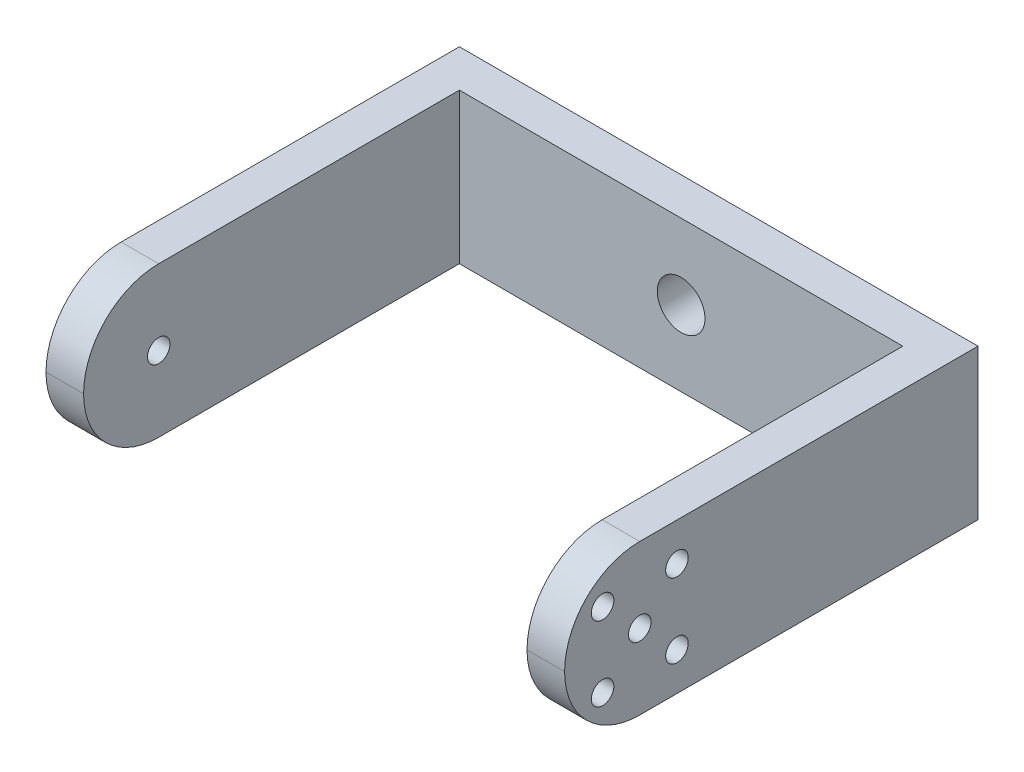
ISO-10303-21;
HEADER;
FILE_DESCRIPTION(('STEP AP214'),'2;1');
FILE_NAME('part.step','',(''),(''),'','','');
FILE_SCHEMA(('AUTOMOTIVE_DESIGN { 1 0 10303 214 1 1 1 1 }'));
ENDSEC;
DATA;
#1=APPLICATION_CONTEXT('core data for automotive mechanical design processes');
#2=APPLICATION_PROTOCOL_DEFINITION('international standard','automotive_design',2000,#1);
#3=PRODUCT_CONTEXT('',#1,'mechanical');
#4=PRODUCT('Part','Part','',(#3));
#5=PRODUCT_RELATED_PRODUCT_CATEGORY('part','',(#4));
#6=PRODUCT_DEFINITION_FORMATION('','',#4);
#7=PRODUCT_DEFINITION_CONTEXT('part definition',#1,'design');
#8=PRODUCT_DEFINITION('design','',#6,#7);
#9=PRODUCT_DEFINITION_SHAPE('','',#8);
#10=(LENGTH_UNIT() NAMED_UNIT(*) SI_UNIT(.MILLI.,.METRE.));
#11=(NAMED_UNIT(*) PLANE_ANGLE_UNIT() SI_UNIT($,.RADIAN.));
#12=(NAMED_UNIT(*) SI_UNIT($,.STERADIAN.) SOLID_ANGLE_UNIT());
#13=UNCERTAINTY_MEASURE_WITH_UNIT(LENGTH_MEASURE(1.E-05),#10,'distance_accuracy_value','');
#14=(GEOMETRIC_REPRESENTATION_CONTEXT(3) GLOBAL_UNCERTAINTY_ASSIGNED_CONTEXT((#13)) GLOBAL_UNIT_ASSIGNED_CONTEXT((#10,
#11,#12)) REPRESENTATION_CONTEXT('',''));
#15=CARTESIAN_POINT('',(0.,0.,0.));
#16=DIRECTION('',(0.,0.,1.));
#17=DIRECTION('',(1.,0.,0.));
#18=AXIS2_PLACEMENT_3D('',#15,#16,#17);
#19=CARTESIAN_POINT('',(0.,0.,5.));
#20=DIRECTION('',(0.,0.,1.));
#21=DIRECTION('',(1.,0.,0.));
#22=AXIS2_PLACEMENT_3D('',#19,#20,#21);
#23=PLANE('',#22);
#24=CARTESIAN_POINT('',(0.,0.,5.));
#25=DIRECTION('',(0.,0.,1.));
#26=DIRECTION('',(1.,0.,0.));
#27=AXIS2_PLACEMENT_3D('',#24,#25,#26);
#28=CIRCLE('',#27,3.175);
#29=CARTESIAN_POINT('',(3.175,0.,5.));
#30=VERTEX_POINT('',#29);
#31=EDGE_CURVE('E399',#30,#30,#28,.T.);
#32=ORIENTED_EDGE('',*,*,#31,.F.);
#33=EDGE_LOOP('',(#32));
#34=FACE_BOUND('',#33,.T.);
#35=DIRECTION('',(1.,0.,0.));
#36=VECTOR('',#35,1.);
#37=CARTESIAN_POINT('',(-34.5,-10.,5.));
#38=LINE('',#37,#36);
#39=CARTESIAN_POINT('',(-29.5,-10.,5.));
#40=VERTEX_POINT('',#39);
#41=CARTESIAN_POINT('',(29.5,-10.,5.));
#42=VERTEX_POINT('',#41);
#43=EDGE_CURVE('E132',#40,#42,#38,.T.);
#44=ORIENTED_EDGE('',*,*,#43,.T.);
#45=DIRECTION('',(0.,-1.,0.));
#46=VECTOR('',#45,1.);
#47=CARTESIAN_POINT('',(29.5,10.,5.));
#48=LINE('',#47,#46);
#49=CARTESIAN_POINT('',(29.5,10.,5.));
#50=VERTEX_POINT('',#49);
#51=EDGE_CURVE('E131',#50,#42,#48,.T.);
#52=ORIENTED_EDGE('',*,*,#51,.F.);
#53=DIRECTION('',(-1.,0.,0.));
#54=VECTOR('',#53,1.);
#55=CARTESIAN_POINT('',(-34.5,10.,5.));
#56=LINE('',#55,#54);
#57=CARTESIAN_POINT('',(-29.5,10.,5.));
#58=VERTEX_POINT('',#57);
#59=EDGE_CURVE('E116',#50,#58,#56,.T.);
#60=ORIENTED_EDGE('',*,*,#59,.T.);
#61=DIRECTION('',(0.,1.,0.));
#62=VECTOR('',#61,1.);
#63=CARTESIAN_POINT('',(-29.5,10.,5.));
#64=LINE('',#63,#62);
#65=EDGE_CURVE('E123',#40,#58,#64,.T.);
#66=ORIENTED_EDGE('',*,*,#65,.F.);
#67=EDGE_LOOP('',(#44,#52,#60,#66));
#68=FACE_BOUND('',#67,.T.);
#69=ADVANCED_FACE('F33',(#34,#68),#23,.T.);
#70=CARTESIAN_POINT('',(34.5,10.,5.));
#71=DIRECTION('',(-1.,0.,0.));
#72=DIRECTION('',(0.,0.,1.));
#73=AXIS2_PLACEMENT_3D('',#70,#71,#72);
#74=PLANE('',#73);
#75=CARTESIAN_POINT('',(34.5,-4.94974746830594,49.9497474683059));
#76=DIRECTION('',(1.,0.,0.));
#77=DIRECTION('',(0.,0.,-1.));
#78=AXIS2_PLACEMENT_3D('',#75,#76,#77);
#79=CIRCLE('',#78,1.5);
#80=CARTESIAN_POINT('',(34.5,-4.94974746830594,48.4497474683059));
#81=VERTEX_POINT('',#80);
#82=EDGE_CURVE('E404',#81,#81,#79,.T.);
#83=ORIENTED_EDGE('',*,*,#82,.F.);
#84=EDGE_LOOP('',(#83));
#85=FACE_BOUND('',#84,.T.);
#86=CARTESIAN_POINT('',(34.5,-4.94974746830573,40.0502525316942));
#87=DIRECTION('',(1.,0.,0.));
#88=DIRECTION('',(0.,0.,-1.));
#89=AXIS2_PLACEMENT_3D('',#86,#87,#88);
#90=CIRCLE('',#89,1.5);
#91=CARTESIAN_POINT('',(34.5,-4.94974746830573,38.5502525316942));
#92=VERTEX_POINT('',#91);
#93=EDGE_CURVE('E410',#92,#92,#90,.T.);
#94=ORIENTED_EDGE('',*,*,#93,.F.);
#95=EDGE_LOOP('',(#94));
#96=FACE_BOUND('',#95,.T.);
#97=CARTESIAN_POINT('',(34.5,4.94974746830581,40.0502525316942));
#98=DIRECTION('',(1.,0.,0.));
#99=DIRECTION('',(0.,0.,-1.));
#100=AXIS2_PLACEMENT_3D('',#97,#98,#99);
#101=CIRCLE('',#100,1.5);
#102=CARTESIAN_POINT('',(34.5,4.94974746830581,38.5502525316942));
#103=VERTEX_POINT('',#102);
#104=EDGE_CURVE('E407',#103,#103,#101,.T.);
#105=ORIENTED_EDGE('',*,*,#104,.F.);
#106=EDGE_LOOP('',(#105));
#107=FACE_BOUND('',#106,.T.);
#108=CARTESIAN_POINT('',(34.5,4.94974746830581,49.9497474683059));
#109=DIRECTION('',(1.,0.,0.));
#110=DIRECTION('',(0.,0.,-1.));
#111=AXIS2_PLACEMENT_3D('',#108,#109,#110);
#112=CIRCLE('',#111,1.5);
#113=CARTESIAN_POINT('',(34.5,4.94974746830581,48.4497474683059));
#114=VERTEX_POINT('',#113);
#115=EDGE_CURVE('E201',#114,#114,#112,.T.);
#116=ORIENTED_EDGE('',*,*,#115,.F.);
#117=EDGE_LOOP('',(#116));
#118=FACE_BOUND('',#117,.T.);
#119=CARTESIAN_POINT('',(34.5,0.,45.));
#120=DIRECTION('',(1.,0.,0.));
#121=DIRECTION('',(0.,0.,-1.));
#122=AXIS2_PLACEMENT_3D('',#119,#120,#121);
#123=CIRCLE('',#122,1.5);
#124=CARTESIAN_POINT('',(34.5,0.,43.5));
#125=VERTEX_POINT('',#124);
#126=EDGE_CURVE('E196',#125,#125,#123,.T.);
#127=ORIENTED_EDGE('',*,*,#126,.F.);
#128=EDGE_LOOP('',(#127));
#129=FACE_BOUND('',#128,.T.);
#130=DIRECTION('',(0.,0.,-1.));
#131=VECTOR('',#130,1.);
#132=CARTESIAN_POINT('',(34.5,10.,5.));
#133=LINE('',#132,#131);
#134=CARTESIAN_POINT('',(34.5,10.,45.));
#135=VERTEX_POINT('',#134);
#136=CARTESIAN_POINT('',(34.5,10.,0.));
#137=VERTEX_POINT('',#136);
#138=EDGE_CURVE('E162',#135,#137,#133,.T.);
#139=ORIENTED_EDGE('',*,*,#138,.F.);
#140=CARTESIAN_POINT('',(34.5,0.,45.));
#141=DIRECTION('',(-1.,0.,0.));
#142=DIRECTION('',(0.,0.,1.));
#143=AXIS2_PLACEMENT_3D('',#140,#141,#142);
#144=CIRCLE('',#143,10.);
#145=CARTESIAN_POINT('',(34.5,0.,55.));
#146=VERTEX_POINT('',#145);
#147=EDGE_CURVE('E11',#135,#146,#144,.F.);
#148=ORIENTED_EDGE('',*,*,#147,.T.);
#149=CARTESIAN_POINT('',(34.5,0.,45.));
#150=DIRECTION('',(-1.,0.,0.));
#151=DIRECTION('',(0.,0.,1.));
#152=AXIS2_PLACEMENT_3D('',#149,#150,#151);
#153=CIRCLE('',#152,10.);
#154=CARTESIAN_POINT('',(34.5,-10.,45.));
#155=VERTEX_POINT('',#154);
#156=EDGE_CURVE('E42',#146,#155,#153,.F.);
#157=ORIENTED_EDGE('',*,*,#156,.T.);
#158=DIRECTION('',(0.,0.,-1.));
#159=VECTOR('',#158,1.);
#160=CARTESIAN_POINT('',(34.5,-10.,5.));
#161=LINE('',#160,#159);
#162=CARTESIAN_POINT('',(34.5,-10.,0.));
#163=VERTEX_POINT('',#162);
#164=EDGE_CURVE('E146',#155,#163,#161,.T.);
#165=ORIENTED_EDGE('',*,*,#164,.T.);
#166=DIRECTION('',(0.,1.,0.));
#167=VECTOR('',#166,1.);
#168=CARTESIAN_POINT('',(34.5,10.,0.));
#169=LINE('',#168,#167);
#170=EDGE_CURVE('E143',#163,#137,#169,.T.);
#171=ORIENTED_EDGE('',*,*,#170,.T.);
#172=EDGE_LOOP('',(#139,#148,#157,#165,#171));
#173=FACE_BOUND('',#172,.T.);
#174=ADVANCED_FACE('F231',(#85,#96,#107,#118,#129,#173),#74,.F.);
#175=CARTESIAN_POINT('',(-34.5,10.,5.));
#176=DIRECTION('',(0.,-1.,0.));
#177=DIRECTION('',(0.,0.,-1.));
#178=AXIS2_PLACEMENT_3D('',#175,#176,#177);
#179=PLANE('',#178);
#180=DIRECTION('',(0.,0.,-1.));
#181=VECTOR('',#180,1.);
#182=CARTESIAN_POINT('',(-34.5,10.,5.));
#183=LINE('',#182,#181);
#184=CARTESIAN_POINT('',(-34.5,10.,45.));
#185=VERTEX_POINT('',#184);
#186=CARTESIAN_POINT('',(-34.5,10.,0.));
#187=VERTEX_POINT('',#186);
#188=EDGE_CURVE('E160',#185,#187,#183,.T.);
#189=ORIENTED_EDGE('',*,*,#188,.F.);
#190=DIRECTION('',(-1.,0.,0.));
#191=VECTOR('',#190,1.);
#192=CARTESIAN_POINT('',(-34.5,10.,45.));
#193=LINE('',#192,#191);
#194=CARTESIAN_POINT('',(-29.5,10.,45.));
#195=VERTEX_POINT('',#194);
#196=EDGE_CURVE('E118',#185,#195,#193,.F.);
#197=ORIENTED_EDGE('',*,*,#196,.T.);
#198=DIRECTION('',(0.,0.,-1.));
#199=VECTOR('',#198,1.);
#200=CARTESIAN_POINT('',(-29.5,10.,55.));
#201=LINE('',#200,#199);
#202=EDGE_CURVE('E111',#195,#58,#201,.T.);
#203=ORIENTED_EDGE('',*,*,#202,.T.);
#204=ORIENTED_EDGE('',*,*,#59,.F.);
#205=DIRECTION('',(0.,0.,-1.));
#206=VECTOR('',#205,1.);
#207=CARTESIAN_POINT('',(29.5,10.,55.));
#208=LINE('',#207,#206);
#209=CARTESIAN_POINT('',(29.5,10.,45.));
#210=VERTEX_POINT('',#209);
#211=EDGE_CURVE('E137',#210,#50,#208,.T.);
#212=ORIENTED_EDGE('',*,*,#211,.F.);
#213=DIRECTION('',(-1.,0.,0.));
#214=VECTOR('',#213,1.);
#215=CARTESIAN_POINT('',(34.5,10.,45.));
#216=LINE('',#215,#214);
#217=EDGE_CURVE('E177',#210,#135,#216,.F.);
#218=ORIENTED_EDGE('',*,*,#217,.T.);
#219=ORIENTED_EDGE('',*,*,#138,.T.);
#220=DIRECTION('',(-1.,0.,0.));
#221=VECTOR('',#220,1.);
#222=CARTESIAN_POINT('',(-34.5,10.,0.));
#223=LINE('',#222,#221);
#224=EDGE_CURVE('E149',#137,#187,#223,.T.);
#225=ORIENTED_EDGE('',*,*,#224,.T.);
#226=EDGE_LOOP('',(#189,#197,#203,#204,#212,#218,#219,#225));
#227=FACE_BOUND('',#226,.T.);
#228=ADVANCED_FACE('F114',(#227),#179,.F.);
#229=CARTESIAN_POINT('',(-34.5,10.,5.));
#230=DIRECTION('',(1.,0.,0.));
#231=DIRECTION('',(0.,0.,-1.));
#232=AXIS2_PLACEMENT_3D('',#229,#230,#231);
#233=PLANE('',#232);
#234=CARTESIAN_POINT('',(-34.5,0.,45.));
#235=DIRECTION('',(1.,0.,0.));
#236=DIRECTION('',(0.,0.,-1.));
#237=AXIS2_PLACEMENT_3D('',#234,#235,#236);
#238=CIRCLE('',#237,1.5);
#239=CARTESIAN_POINT('',(-34.5,0.,43.5));
#240=VERTEX_POINT('',#239);
#241=EDGE_CURVE('E191',#240,#240,#238,.T.);
#242=ORIENTED_EDGE('',*,*,#241,.T.);
#243=EDGE_LOOP('',(#242));
#244=FACE_BOUND('',#243,.T.);
#245=DIRECTION('',(0.,0.,-1.));
#246=VECTOR('',#245,1.);
#247=CARTESIAN_POINT('',(-34.5,-10.,5.));
#248=LINE('',#247,#246);
#249=CARTESIAN_POINT('',(-34.5,-10.,45.));
#250=VERTEX_POINT('',#249);
#251=CARTESIAN_POINT('',(-34.5,-10.,0.));
#252=VERTEX_POINT('',#251);
#253=EDGE_CURVE('E158',#250,#252,#248,.T.);
#254=ORIENTED_EDGE('',*,*,#253,.F.);
#255=CARTESIAN_POINT('',(-34.5,0.,45.));
#256=DIRECTION('',(1.,0.,0.));
#257=DIRECTION('',(0.,0.,-1.));
#258=AXIS2_PLACEMENT_3D('',#255,#256,#257);
#259=CIRCLE('',#258,10.);
#260=CARTESIAN_POINT('',(-34.5,0.,55.));
#261=VERTEX_POINT('',#260);
#262=EDGE_CURVE('E175',#250,#261,#259,.F.);
#263=ORIENTED_EDGE('',*,*,#262,.T.);
#264=CARTESIAN_POINT('',(-34.5,0.,45.));
#265=DIRECTION('',(1.,0.,0.));
#266=DIRECTION('',(0.,0.,-1.));
#267=AXIS2_PLACEMENT_3D('',#264,#265,#266);
#268=CIRCLE('',#267,10.);
#269=EDGE_CURVE('E173',#261,#185,#268,.F.);
#270=ORIENTED_EDGE('',*,*,#269,.T.);
#271=ORIENTED_EDGE('',*,*,#188,.T.);
#272=DIRECTION('',(0.,-1.,0.));
#273=VECTOR('',#272,1.);
#274=CARTESIAN_POINT('',(-34.5,10.,0.));
#275=LINE('',#274,#273);
#276=EDGE_CURVE('E152',#187,#252,#275,.T.);
#277=ORIENTED_EDGE('',*,*,#276,.T.);
#278=EDGE_LOOP('',(#254,#263,#270,#271,#277));
#279=FACE_BOUND('',#278,.T.);
#280=ADVANCED_FACE('F240',(#244,#279),#233,.F.);
#281=CARTESIAN_POINT('',(-34.5,-10.,5.));
#282=DIRECTION('',(0.,1.,0.));
#283=DIRECTION('',(0.,0.,1.));
#284=AXIS2_PLACEMENT_3D('',#281,#282,#283);
#285=PLANE('',#284);
#286=DIRECTION('',(0.,0.,-1.));
#287=VECTOR('',#286,1.);
#288=CARTESIAN_POINT('',(-29.5,-10.,55.));
#289=LINE('',#288,#287);
#290=CARTESIAN_POINT('',(-29.5,-10.,45.));
#291=VERTEX_POINT('',#290);
#292=EDGE_CURVE('E122',#291,#40,#289,.T.);
#293=ORIENTED_EDGE('',*,*,#292,.F.);
#294=DIRECTION('',(1.,0.,0.));
#295=VECTOR('',#294,1.);
#296=CARTESIAN_POINT('',(-34.5,-10.,45.));
#297=LINE('',#296,#295);
#298=EDGE_CURVE('E170',#291,#250,#297,.F.);
#299=ORIENTED_EDGE('',*,*,#298,.T.);
#300=ORIENTED_EDGE('',*,*,#253,.T.);
#301=DIRECTION('',(1.,0.,0.));
#302=VECTOR('',#301,1.);
#303=CARTESIAN_POINT('',(-34.5,-10.,0.));
#304=LINE('',#303,#302);
#305=EDGE_CURVE('E133',#252,#163,#304,.T.);
#306=ORIENTED_EDGE('',*,*,#305,.T.);
#307=ORIENTED_EDGE('',*,*,#164,.F.);
#308=DIRECTION('',(1.,0.,0.));
#309=VECTOR('',#308,1.);
#310=CARTESIAN_POINT('',(29.5,-10.,45.));
#311=LINE('',#310,#309);
#312=CARTESIAN_POINT('',(29.5,-10.,45.));
#313=VERTEX_POINT('',#312);
#314=EDGE_CURVE('E168',#155,#313,#311,.F.);
#315=ORIENTED_EDGE('',*,*,#314,.T.);
#316=DIRECTION('',(0.,0.,-1.));
#317=VECTOR('',#316,1.);
#318=CARTESIAN_POINT('',(29.5,-10.,55.));
#319=LINE('',#318,#317);
#320=EDGE_CURVE('E139',#313,#42,#319,.T.);
#321=ORIENTED_EDGE('',*,*,#320,.T.);
#322=ORIENTED_EDGE('',*,*,#43,.F.);
#323=EDGE_LOOP('',(#293,#299,#300,#306,#307,#315,#321,#322));
#324=FACE_BOUND('',#323,.T.);
#325=ADVANCED_FACE('F222',(#324),#285,.F.);
#326=CARTESIAN_POINT('',(0.,0.,0.));
#327=DIRECTION('',(0.,0.,1.));
#328=DIRECTION('',(1.,0.,0.));
#329=AXIS2_PLACEMENT_3D('',#326,#327,#328);
#330=PLANE('',#329);
#331=CARTESIAN_POINT('',(0.,0.,0.));
#332=DIRECTION('',(0.,0.,-1.));
#333=DIRECTION('',(-1.,0.,0.));
#334=AXIS2_PLACEMENT_3D('',#331,#332,#333);
#335=CIRCLE('',#334,3.175);
#336=CARTESIAN_POINT('',(-3.175,0.,0.));
#337=VERTEX_POINT('',#336);
#338=EDGE_CURVE('E402',#337,#337,#335,.T.);
#339=ORIENTED_EDGE('',*,*,#338,.F.);
#340=EDGE_LOOP('',(#339));
#341=FACE_BOUND('',#340,.T.);
#342=ORIENTED_EDGE('',*,*,#170,.F.);
#343=ORIENTED_EDGE('',*,*,#305,.F.);
#344=ORIENTED_EDGE('',*,*,#276,.F.);
#345=ORIENTED_EDGE('',*,*,#224,.F.);
#346=EDGE_LOOP('',(#342,#343,#344,#345));
#347=FACE_BOUND('',#346,.T.);
#348=ADVANCED_FACE('F238',(#341,#347),#330,.F.);
#349=CARTESIAN_POINT('',(-29.5,10.,55.));
#350=DIRECTION('',(-1.,0.,0.));
#351=DIRECTION('',(0.,0.,1.));
#352=AXIS2_PLACEMENT_3D('',#349,#350,#351);
#353=PLANE('',#352);
#354=CARTESIAN_POINT('',(-29.5,0.,45.));
#355=DIRECTION('',(-1.,0.,0.));
#356=DIRECTION('',(0.,0.,1.));
#357=AXIS2_PLACEMENT_3D('',#354,#355,#356);
#358=CIRCLE('',#357,1.5);
#359=CARTESIAN_POINT('',(-29.5,0.,46.5));
#360=VERTEX_POINT('',#359);
#361=EDGE_CURVE('E195',#360,#360,#358,.T.);
#362=ORIENTED_EDGE('',*,*,#361,.T.);
#363=EDGE_LOOP('',(#362));
#364=FACE_BOUND('',#363,.T.);
#365=CARTESIAN_POINT('',(-29.5,0.,45.));
#366=DIRECTION('',(-1.,0.,0.));
#367=DIRECTION('',(0.,0.,1.));
#368=AXIS2_PLACEMENT_3D('',#365,#366,#367);
#369=CIRCLE('',#368,10.);
#370=CARTESIAN_POINT('',(-29.5,0.,55.));
#371=VERTEX_POINT('',#370);
#372=EDGE_CURVE('E164',#195,#371,#369,.F.);
#373=ORIENTED_EDGE('',*,*,#372,.T.);
#374=CARTESIAN_POINT('',(-29.5,0.,45.));
#375=DIRECTION('',(-1.,0.,0.));
#376=DIRECTION('',(0.,0.,1.));
#377=AXIS2_PLACEMENT_3D('',#374,#375,#376);
#378=CIRCLE('',#377,10.);
#379=EDGE_CURVE('E166',#371,#291,#378,.F.);
#380=ORIENTED_EDGE('',*,*,#379,.T.);
#381=ORIENTED_EDGE('',*,*,#292,.T.);
#382=ORIENTED_EDGE('',*,*,#65,.T.);
#383=ORIENTED_EDGE('',*,*,#202,.F.);
#384=EDGE_LOOP('',(#373,#380,#381,#382,#383));
#385=FACE_BOUND('',#384,.T.);
#386=ADVANCED_FACE('F135',(#364,#385),#353,.F.);
#387=CARTESIAN_POINT('',(29.5,10.,55.));
#388=DIRECTION('',(1.,0.,0.));
#389=DIRECTION('',(0.,0.,-1.));
#390=AXIS2_PLACEMENT_3D('',#387,#388,#389);
#391=PLANE('',#390);
#392=CARTESIAN_POINT('',(29.5,-4.94974746830594,49.9497474683059));
#393=DIRECTION('',(1.,0.,0.));
#394=DIRECTION('',(0.,0.,-1.));
#395=AXIS2_PLACEMENT_3D('',#392,#393,#394);
#396=CIRCLE('',#395,1.5);
#397=CARTESIAN_POINT('',(29.5,-4.94974746830594,48.4497474683059));
#398=VERTEX_POINT('',#397);
#399=EDGE_CURVE('E37',#398,#398,#396,.T.);
#400=ORIENTED_EDGE('',*,*,#399,.T.);
#401=EDGE_LOOP('',(#400));
#402=FACE_BOUND('',#401,.T.);
#403=CARTESIAN_POINT('',(29.5,-4.94974746830573,40.0502525316942));
#404=DIRECTION('',(1.,0.,0.));
#405=DIRECTION('',(0.,0.,-1.));
#406=AXIS2_PLACEMENT_3D('',#403,#404,#405);
#407=CIRCLE('',#406,1.5);
#408=CARTESIAN_POINT('',(29.5,-4.94974746830573,38.5502525316942));
#409=VERTEX_POINT('',#408);
#410=EDGE_CURVE('E203',#409,#409,#407,.T.);
#411=ORIENTED_EDGE('',*,*,#410,.T.);
#412=EDGE_LOOP('',(#411));
#413=FACE_BOUND('',#412,.T.);
#414=CARTESIAN_POINT('',(29.5,4.94974746830581,40.0502525316942));
#415=DIRECTION('',(1.,0.,0.));
#416=DIRECTION('',(0.,0.,-1.));
#417=AXIS2_PLACEMENT_3D('',#414,#415,#416);
#418=CIRCLE('',#417,1.5);
#419=CARTESIAN_POINT('',(29.5,4.94974746830581,38.5502525316942));
#420=VERTEX_POINT('',#419);
#421=EDGE_CURVE('E200',#420,#420,#418,.T.);
#422=ORIENTED_EDGE('',*,*,#421,.T.);
#423=EDGE_LOOP('',(#422));
#424=FACE_BOUND('',#423,.T.);
#425=CARTESIAN_POINT('',(29.5,4.94974746830581,49.9497474683059));
#426=DIRECTION('',(1.,0.,0.));
#427=DIRECTION('',(0.,0.,-1.));
#428=AXIS2_PLACEMENT_3D('',#425,#426,#427);
#429=CIRCLE('',#428,1.5);
#430=CARTESIAN_POINT('',(29.5,4.94974746830581,48.4497474683059));
#431=VERTEX_POINT('',#430);
#432=EDGE_CURVE('E197',#431,#431,#429,.T.);
#433=ORIENTED_EDGE('',*,*,#432,.T.);
#434=EDGE_LOOP('',(#433));
#435=FACE_BOUND('',#434,.T.);
#436=CARTESIAN_POINT('',(29.5,0.,45.));
#437=DIRECTION('',(1.,0.,0.));
#438=DIRECTION('',(0.,0.,-1.));
#439=AXIS2_PLACEMENT_3D('',#436,#437,#438);
#440=CIRCLE('',#439,1.5);
#441=CARTESIAN_POINT('',(29.5,0.,43.5));
#442=VERTEX_POINT('',#441);
#443=EDGE_CURVE('E192',#442,#442,#440,.T.);
#444=ORIENTED_EDGE('',*,*,#443,.T.);
#445=EDGE_LOOP('',(#444));
#446=FACE_BOUND('',#445,.T.);
#447=CARTESIAN_POINT('',(29.5,0.,45.));
#448=DIRECTION('',(1.,0.,0.));
#449=DIRECTION('',(0.,0.,-1.));
#450=AXIS2_PLACEMENT_3D('',#447,#448,#449);
#451=CIRCLE('',#450,10.);
#452=CARTESIAN_POINT('',(29.5,0.,55.));
#453=VERTEX_POINT('',#452);
#454=EDGE_CURVE('E56',#313,#453,#451,.F.);
#455=ORIENTED_EDGE('',*,*,#454,.T.);
#456=CARTESIAN_POINT('',(29.5,0.,45.));
#457=DIRECTION('',(1.,0.,0.));
#458=DIRECTION('',(0.,0.,-1.));
#459=AXIS2_PLACEMENT_3D('',#456,#457,#458);
#460=CIRCLE('',#459,10.);
#461=EDGE_CURVE('E182',#453,#210,#460,.F.);
#462=ORIENTED_EDGE('',*,*,#461,.T.);
#463=ORIENTED_EDGE('',*,*,#211,.T.);
#464=ORIENTED_EDGE('',*,*,#51,.T.);
#465=ORIENTED_EDGE('',*,*,#320,.F.);
#466=EDGE_LOOP('',(#455,#462,#463,#464,#465));
#467=FACE_BOUND('',#466,.T.);
#468=ADVANCED_FACE('F225',(#402,#413,#424,#435,#446,#467),#391,.F.);
#469=CARTESIAN_POINT('',(0.,0.,45.));
#470=DIRECTION('',(-1.,0.,0.));
#471=DIRECTION('',(0.,0.,1.));
#472=AXIS2_PLACEMENT_3D('',#469,#470,#471);
#473=CYLINDRICAL_SURFACE('',#472,10.);
#474=ORIENTED_EDGE('',*,*,#196,.F.);
#475=ORIENTED_EDGE('',*,*,#269,.F.);
#476=DIRECTION('',(-1.,0.,0.));
#477=VECTOR('',#476,1.);
#478=CARTESIAN_POINT('',(0.,0.,55.));
#479=LINE('',#478,#477);
#480=EDGE_CURVE('E185',#371,#261,#479,.T.);
#481=ORIENTED_EDGE('',*,*,#480,.F.);
#482=ORIENTED_EDGE('',*,*,#372,.F.);
#483=EDGE_LOOP('',(#474,#475,#481,#482));
#484=FACE_BOUND('',#483,.T.);
#485=ADVANCED_FACE('F244',(#484),#473,.T.);
#486=CARTESIAN_POINT('',(0.,0.,45.));
#487=DIRECTION('',(1.,0.,0.));
#488=DIRECTION('',(0.,0.,-1.));
#489=AXIS2_PLACEMENT_3D('',#486,#487,#488);
#490=CYLINDRICAL_SURFACE('',#489,10.);
#491=ORIENTED_EDGE('',*,*,#262,.F.);
#492=ORIENTED_EDGE('',*,*,#298,.F.);
#493=ORIENTED_EDGE('',*,*,#379,.F.);
#494=ORIENTED_EDGE('',*,*,#480,.T.);
#495=EDGE_LOOP('',(#491,#492,#493,#494));
#496=FACE_BOUND('',#495,.T.);
#497=ADVANCED_FACE('F247',(#496),#490,.T.);
#498=CARTESIAN_POINT('',(0.,0.,45.));
#499=DIRECTION('',(-1.,0.,0.));
#500=DIRECTION('',(0.,0.,1.));
#501=AXIS2_PLACEMENT_3D('',#498,#499,#500);
#502=CYLINDRICAL_SURFACE('',#501,10.);
#503=ORIENTED_EDGE('',*,*,#314,.F.);
#504=ORIENTED_EDGE('',*,*,#156,.F.);
#505=DIRECTION('',(1.,0.,0.));
#506=VECTOR('',#505,1.);
#507=CARTESIAN_POINT('',(34.5,0.,55.));
#508=LINE('',#507,#506);
#509=EDGE_CURVE('E188',#453,#146,#508,.T.);
#510=ORIENTED_EDGE('',*,*,#509,.F.);
#511=ORIENTED_EDGE('',*,*,#454,.F.);
#512=EDGE_LOOP('',(#503,#504,#510,#511));
#513=FACE_BOUND('',#512,.T.);
#514=ADVANCED_FACE('F35',(#513),#502,.T.);
#515=CARTESIAN_POINT('',(0.,0.,45.));
#516=DIRECTION('',(1.,0.,0.));
#517=DIRECTION('',(0.,0.,-1.));
#518=AXIS2_PLACEMENT_3D('',#515,#516,#517);
#519=CYLINDRICAL_SURFACE('',#518,10.);
#520=ORIENTED_EDGE('',*,*,#147,.F.);
#521=ORIENTED_EDGE('',*,*,#217,.F.);
#522=ORIENTED_EDGE('',*,*,#461,.F.);
#523=ORIENTED_EDGE('',*,*,#509,.T.);
#524=EDGE_LOOP('',(#520,#521,#522,#523));
#525=FACE_BOUND('',#524,.T.);
#526=ADVANCED_FACE('F229',(#525),#519,.T.);
#527=CARTESIAN_POINT('',(-47.5,0.,45.));
#528=DIRECTION('',(1.,0.,0.));
#529=DIRECTION('',(0.,0.,-1.));
#530=AXIS2_PLACEMENT_3D('',#527,#528,#529);
#531=CYLINDRICAL_SURFACE('',#530,1.5);
#532=ORIENTED_EDGE('',*,*,#126,.T.);
#533=EDGE_LOOP('',(#532));
#534=FACE_BOUND('',#533,.T.);
#535=ORIENTED_EDGE('',*,*,#443,.F.);
#536=EDGE_LOOP('',(#535));
#537=FACE_BOUND('',#536,.T.);
#538=ADVANCED_FACE('F329',(#534,#537),#531,.F.);
#539=ORIENTED_EDGE('',*,*,#361,.F.);
#540=EDGE_LOOP('',(#539));
#541=FACE_BOUND('',#540,.T.);
#542=ORIENTED_EDGE('',*,*,#241,.F.);
#543=EDGE_LOOP('',(#542));
#544=FACE_BOUND('',#543,.T.);
#545=ADVANCED_FACE('F337',(#541,#544),#531,.F.);
#546=CARTESIAN_POINT('',(24.5,4.94974746830581,49.9497474683059));
#547=DIRECTION('',(1.,0.,0.));
#548=DIRECTION('',(0.,0.,-1.));
#549=AXIS2_PLACEMENT_3D('',#546,#547,#548);
#550=CYLINDRICAL_SURFACE('',#549,1.5);
#551=ORIENTED_EDGE('',*,*,#115,.T.);
#552=EDGE_LOOP('',(#551));
#553=FACE_BOUND('',#552,.T.);
#554=ORIENTED_EDGE('',*,*,#432,.F.);
#555=EDGE_LOOP('',(#554));
#556=FACE_BOUND('',#555,.T.);
#557=ADVANCED_FACE('F343',(#553,#556),#550,.F.);
#558=CARTESIAN_POINT('',(24.5,4.94974746830581,40.0502525316942));
#559=DIRECTION('',(1.,0.,0.));
#560=DIRECTION('',(0.,0.,-1.));
#561=AXIS2_PLACEMENT_3D('',#558,#559,#560);
#562=CYLINDRICAL_SURFACE('',#561,1.5);
#563=ORIENTED_EDGE('',*,*,#104,.T.);
#564=EDGE_LOOP('',(#563));
#565=FACE_BOUND('',#564,.T.);
#566=ORIENTED_EDGE('',*,*,#421,.F.);
#567=EDGE_LOOP('',(#566));
#568=FACE_BOUND('',#567,.T.);
#569=ADVANCED_FACE('F349',(#565,#568),#562,.F.);
#570=CARTESIAN_POINT('',(24.5,-4.94974746830573,40.0502525316942));
#571=DIRECTION('',(1.,0.,0.));
#572=DIRECTION('',(0.,0.,-1.));
#573=AXIS2_PLACEMENT_3D('',#570,#571,#572);
#574=CYLINDRICAL_SURFACE('',#573,1.5);
#575=ORIENTED_EDGE('',*,*,#93,.T.);
#576=EDGE_LOOP('',(#575));
#577=FACE_BOUND('',#576,.T.);
#578=ORIENTED_EDGE('',*,*,#410,.F.);
#579=EDGE_LOOP('',(#578));
#580=FACE_BOUND('',#579,.T.);
#581=ADVANCED_FACE('F357',(#577,#580),#574,.F.);
#582=CARTESIAN_POINT('',(24.5,-4.94974746830594,49.9497474683059));
#583=DIRECTION('',(1.,0.,0.));
#584=DIRECTION('',(0.,0.,-1.));
#585=AXIS2_PLACEMENT_3D('',#582,#583,#584);
#586=CYLINDRICAL_SURFACE('',#585,1.5);
#587=ORIENTED_EDGE('',*,*,#82,.T.);
#588=EDGE_LOOP('',(#587));
#589=FACE_BOUND('',#588,.T.);
#590=ORIENTED_EDGE('',*,*,#399,.F.);
#591=EDGE_LOOP('',(#590));
#592=FACE_BOUND('',#591,.T.);
#593=ADVANCED_FACE('F365',(#589,#592),#586,.F.);
#594=CARTESIAN_POINT('',(0.,0.,10.));
#595=DIRECTION('',(0.,0.,-1.));
#596=DIRECTION('',(-1.,0.,0.));
#597=AXIS2_PLACEMENT_3D('',#594,#595,#596);
#598=CYLINDRICAL_SURFACE('',#597,3.175);
#599=ORIENTED_EDGE('',*,*,#31,.T.);
#600=EDGE_LOOP('',(#599));
#601=FACE_BOUND('',#600,.T.);
#602=ORIENTED_EDGE('',*,*,#338,.T.);
#603=EDGE_LOOP('',(#602));
#604=FACE_BOUND('',#603,.T.);
#605=ADVANCED_FACE('F373',(#601,#604),#598,.F.);
#606=CLOSED_SHELL('',(#69,#174,#228,#280,#325,#348,#386,#468,#485,#497,#514,#526,#538,#545,#557,
#569,#581,#593,#605));
#607=MANIFOLD_SOLID_BREP('B2',#606);
#608=ADVANCED_BREP_SHAPE_REPRESENTATION('',(#18,#607),#14);
#609=SHAPE_DEFINITION_REPRESENTATION(#9,#608);
ENDSEC;
END-ISO-10303-21;
